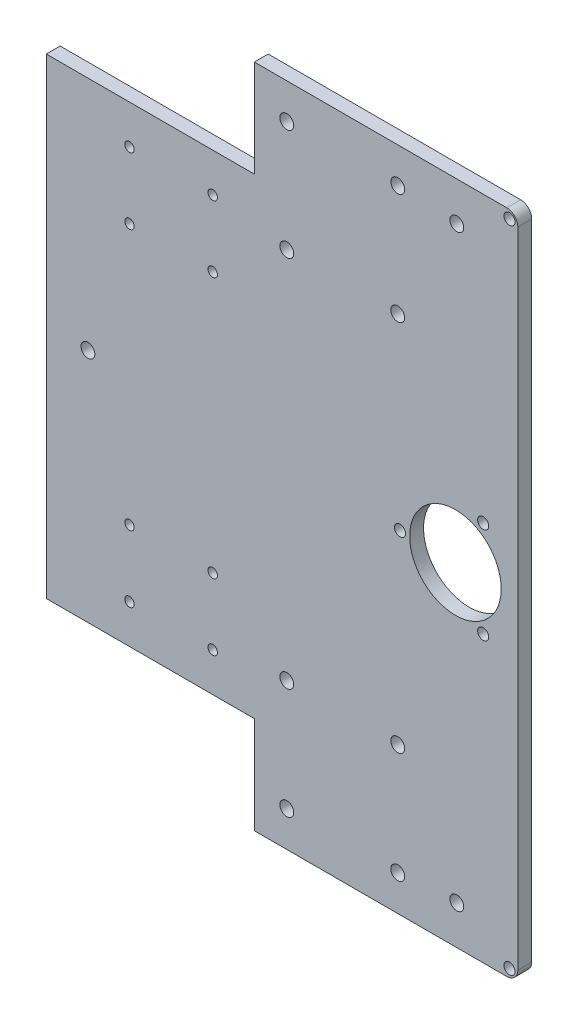
ISO-10303-21;
HEADER;
FILE_DESCRIPTION(('STEP AP214'),'2;1');
FILE_NAME('part.step','',(''),(''),'','','');
FILE_SCHEMA(('AUTOMOTIVE_DESIGN { 1 0 10303 214 1 1 1 1 }'));
ENDSEC;
DATA;
#1=APPLICATION_CONTEXT('core data for automotive mechanical design processes');
#2=APPLICATION_PROTOCOL_DEFINITION('international standard','automotive_design',2000,#1);
#3=PRODUCT_CONTEXT('',#1,'mechanical');
#4=PRODUCT('Part','Part','',(#3));
#5=PRODUCT_RELATED_PRODUCT_CATEGORY('part','',(#4));
#6=PRODUCT_DEFINITION_FORMATION('','',#4);
#7=PRODUCT_DEFINITION_CONTEXT('part definition',#1,'design');
#8=PRODUCT_DEFINITION('design','',#6,#7);
#9=PRODUCT_DEFINITION_SHAPE('','',#8);
#10=(LENGTH_UNIT() NAMED_UNIT(*) SI_UNIT(.MILLI.,.METRE.));
#11=(NAMED_UNIT(*) PLANE_ANGLE_UNIT() SI_UNIT($,.RADIAN.));
#12=(NAMED_UNIT(*) SI_UNIT($,.STERADIAN.) SOLID_ANGLE_UNIT());
#13=UNCERTAINTY_MEASURE_WITH_UNIT(LENGTH_MEASURE(1.E-05),#10,'distance_accuracy_value','');
#14=(GEOMETRIC_REPRESENTATION_CONTEXT(3) GLOBAL_UNCERTAINTY_ASSIGNED_CONTEXT((#13)) GLOBAL_UNIT_ASSIGNED_CONTEXT((#10,
#11,#12)) REPRESENTATION_CONTEXT('',''));
#15=CARTESIAN_POINT('',(0.,0.,0.));
#16=DIRECTION('',(0.,0.,1.));
#17=DIRECTION('',(1.,0.,0.));
#18=AXIS2_PLACEMENT_3D('',#15,#16,#17);
#19=CARTESIAN_POINT('',(85.,120.,5.));
#20=DIRECTION('',(-1.,0.,0.));
#21=DIRECTION('',(0.,0.,1.));
#22=AXIS2_PLACEMENT_3D('',#19,#20,#21);
#23=PLANE('',#22);
#24=DIRECTION('',(0.,1.,0.));
#25=VECTOR('',#24,1.);
#26=CARTESIAN_POINT('',(85.,120.,0.));
#27=LINE('',#26,#25);
#28=CARTESIAN_POINT('',(85.,-116.,0.));
#29=VERTEX_POINT('',#28);
#30=CARTESIAN_POINT('',(85.,116.,0.));
#31=VERTEX_POINT('',#30);
#32=EDGE_CURVE('E120',#29,#31,#27,.T.);
#33=ORIENTED_EDGE('',*,*,#32,.T.);
#34=DIRECTION('',(0.,0.,-1.));
#35=VECTOR('',#34,1.);
#36=CARTESIAN_POINT('',(85.,116.,5.));
#37=LINE('',#36,#35);
#38=CARTESIAN_POINT('',(85.,116.,5.));
#39=VERTEX_POINT('',#38);
#40=EDGE_CURVE('E42',#31,#39,#37,.F.);
#41=ORIENTED_EDGE('',*,*,#40,.T.);
#42=DIRECTION('',(0.,1.,0.));
#43=VECTOR('',#42,1.);
#44=CARTESIAN_POINT('',(85.,120.,5.));
#45=LINE('',#44,#43);
#46=CARTESIAN_POINT('',(85.,-116.,5.));
#47=VERTEX_POINT('',#46);
#48=EDGE_CURVE('E239',#47,#39,#45,.T.);
#49=ORIENTED_EDGE('',*,*,#48,.F.);
#50=DIRECTION('',(0.,0.,-1.));
#51=VECTOR('',#50,1.);
#52=CARTESIAN_POINT('',(85.,-116.,5.));
#53=LINE('',#52,#51);
#54=EDGE_CURVE('E250',#47,#29,#53,.T.);
#55=ORIENTED_EDGE('',*,*,#54,.T.);
#56=EDGE_LOOP('',(#33,#41,#49,#55));
#57=FACE_BOUND('',#56,.T.);
#58=ADVANCED_FACE('F34',(#57),#23,.F.);
#59=CARTESIAN_POINT('',(-85.,120.,5.));
#60=DIRECTION('',(0.,-1.,0.));
#61=DIRECTION('',(0.,0.,-1.));
#62=AXIS2_PLACEMENT_3D('',#59,#60,#61);
#63=PLANE('',#62);
#64=DIRECTION('',(-1.,0.,0.));
#65=VECTOR('',#64,1.);
#66=CARTESIAN_POINT('',(-85.,120.,5.));
#67=LINE('',#66,#65);
#68=CARTESIAN_POINT('',(81.,120.,5.));
#69=VERTEX_POINT('',#68);
#70=CARTESIAN_POINT('',(-10.,120.,5.));
#71=VERTEX_POINT('',#70);
#72=EDGE_CURVE('E241',#69,#71,#67,.T.);
#73=ORIENTED_EDGE('',*,*,#72,.F.);
#74=DIRECTION('',(0.,0.,-1.));
#75=VECTOR('',#74,1.);
#76=CARTESIAN_POINT('',(81.,120.,5.));
#77=LINE('',#76,#75);
#78=CARTESIAN_POINT('',(81.,120.,0.));
#79=VERTEX_POINT('',#78);
#80=EDGE_CURVE('E117',#69,#79,#77,.T.);
#81=ORIENTED_EDGE('',*,*,#80,.T.);
#82=DIRECTION('',(-1.,0.,0.));
#83=VECTOR('',#82,1.);
#84=CARTESIAN_POINT('',(-85.,120.,0.));
#85=LINE('',#84,#83);
#86=CARTESIAN_POINT('',(-10.,120.,0.));
#87=VERTEX_POINT('',#86);
#88=EDGE_CURVE('E111',#79,#87,#85,.T.);
#89=ORIENTED_EDGE('',*,*,#88,.T.);
#90=DIRECTION('',(0.,0.,1.));
#91=VECTOR('',#90,1.);
#92=CARTESIAN_POINT('',(-10.,120.,0.));
#93=LINE('',#92,#91);
#94=EDGE_CURVE('E115',#87,#71,#93,.T.);
#95=ORIENTED_EDGE('',*,*,#94,.T.);
#96=EDGE_LOOP('',(#73,#81,#89,#95));
#97=FACE_BOUND('',#96,.T.);
#98=ADVANCED_FACE('F114',(#97),#63,.F.);
#99=CARTESIAN_POINT('',(-85.,120.,5.));
#100=DIRECTION('',(1.,0.,0.));
#101=DIRECTION('',(0.,1.,0.));
#102=AXIS2_PLACEMENT_3D('',#99,#100,#101);
#103=PLANE('',#102);
#104=DIRECTION('',(0.,-1.,0.));
#105=VECTOR('',#104,1.);
#106=CARTESIAN_POINT('',(-85.,120.,5.));
#107=LINE('',#106,#105);
#108=CARTESIAN_POINT('',(-85.,85.,5.));
#109=VERTEX_POINT('',#108);
#110=CARTESIAN_POINT('',(-85.,-85.,5.));
#111=VERTEX_POINT('',#110);
#112=EDGE_CURVE('E244',#109,#111,#107,.T.);
#113=ORIENTED_EDGE('',*,*,#112,.F.);
#114=DIRECTION('',(0.,0.,1.));
#115=VECTOR('',#114,1.);
#116=CARTESIAN_POINT('',(-85.,85.,0.));
#117=LINE('',#116,#115);
#118=CARTESIAN_POINT('',(-85.,85.,0.));
#119=VERTEX_POINT('',#118);
#120=EDGE_CURVE('E129',#119,#109,#117,.T.);
#121=ORIENTED_EDGE('',*,*,#120,.F.);
#122=DIRECTION('',(0.,-1.,0.));
#123=VECTOR('',#122,1.);
#124=CARTESIAN_POINT('',(-85.,120.,0.));
#125=LINE('',#124,#123);
#126=CARTESIAN_POINT('',(-85.,-85.,0.));
#127=VERTEX_POINT('',#126);
#128=EDGE_CURVE('E119',#119,#127,#125,.T.);
#129=ORIENTED_EDGE('',*,*,#128,.T.);
#130=DIRECTION('',(0.,0.,1.));
#131=VECTOR('',#130,1.);
#132=CARTESIAN_POINT('',(-85.,-85.,0.));
#133=LINE('',#132,#131);
#134=EDGE_CURVE('E164',#127,#111,#133,.T.);
#135=ORIENTED_EDGE('',*,*,#134,.T.);
#136=EDGE_LOOP('',(#113,#121,#129,#135));
#137=FACE_BOUND('',#136,.T.);
#138=ADVANCED_FACE('F289',(#137),#103,.F.);
#139=CARTESIAN_POINT('',(-85.,-120.,5.));
#140=DIRECTION('',(0.,1.,0.));
#141=DIRECTION('',(0.,0.,1.));
#142=AXIS2_PLACEMENT_3D('',#139,#140,#141);
#143=PLANE('',#142);
#144=DIRECTION('',(1.,0.,0.));
#145=VECTOR('',#144,1.);
#146=CARTESIAN_POINT('',(-85.,-120.,0.));
#147=LINE('',#146,#145);
#148=CARTESIAN_POINT('',(-10.,-120.,0.));
#149=VERTEX_POINT('',#148);
#150=CARTESIAN_POINT('',(81.,-120.,0.));
#151=VERTEX_POINT('',#150);
#152=EDGE_CURVE('E242',#149,#151,#147,.T.);
#153=ORIENTED_EDGE('',*,*,#152,.T.);
#154=DIRECTION('',(0.,0.,-1.));
#155=VECTOR('',#154,1.);
#156=CARTESIAN_POINT('',(81.,-120.,5.));
#157=LINE('',#156,#155);
#158=CARTESIAN_POINT('',(81.,-120.,5.));
#159=VERTEX_POINT('',#158);
#160=EDGE_CURVE('E260',#151,#159,#157,.F.);
#161=ORIENTED_EDGE('',*,*,#160,.T.);
#162=DIRECTION('',(1.,0.,0.));
#163=VECTOR('',#162,1.);
#164=CARTESIAN_POINT('',(-85.,-120.,5.));
#165=LINE('',#164,#163);
#166=CARTESIAN_POINT('',(-10.,-120.,5.));
#167=VERTEX_POINT('',#166);
#168=EDGE_CURVE('E247',#167,#159,#165,.T.);
#169=ORIENTED_EDGE('',*,*,#168,.F.);
#170=DIRECTION('',(0.,0.,1.));
#171=VECTOR('',#170,1.);
#172=CARTESIAN_POINT('',(-10.,-120.,0.));
#173=LINE('',#172,#171);
#174=EDGE_CURVE('E144',#149,#167,#173,.T.);
#175=ORIENTED_EDGE('',*,*,#174,.F.);
#176=EDGE_LOOP('',(#153,#161,#169,#175));
#177=FACE_BOUND('',#176,.T.);
#178=ADVANCED_FACE('F279',(#177),#143,.F.);
#179=CARTESIAN_POINT('',(0.,0.,5.));
#180=DIRECTION('',(0.,0.,1.));
#181=DIRECTION('',(1.,0.,0.));
#182=AXIS2_PLACEMENT_3D('',#179,#180,#181);
#183=PLANE('',#182);
#184=CARTESIAN_POINT('',(62.9999999999836,105.99999999999,5.));
#185=DIRECTION('',(0.,0.,-1.));
#186=DIRECTION('',(-1.,0.,0.));
#187=AXIS2_PLACEMENT_3D('',#184,#185,#186);
#188=CIRCLE('',#187,2.49999999998859);
#189=CARTESIAN_POINT('',(60.499999999995,105.99999999999,5.));
#190=VERTEX_POINT('',#189);
#191=EDGE_CURVE('E597',#190,#190,#188,.T.);
#192=ORIENTED_EDGE('',*,*,#191,.T.);
#193=EDGE_LOOP('',(#192));
#194=FACE_BOUND('',#193,.T.);
#195=CARTESIAN_POINT('',(62.9999999999836,-105.99999999999,5.));
#196=DIRECTION('',(0.,0.,-1.));
#197=DIRECTION('',(-1.,0.,0.));
#198=AXIS2_PLACEMENT_3D('',#195,#196,#197);
#199=CIRCLE('',#198,2.5);
#200=CARTESIAN_POINT('',(60.4999999999836,-105.99999999999,5.));
#201=VERTEX_POINT('',#200);
#202=EDGE_CURVE('E601',#201,#201,#199,.T.);
#203=ORIENTED_EDGE('',*,*,#202,.T.);
#204=EDGE_LOOP('',(#203));
#205=FACE_BOUND('',#204,.T.);
#206=CARTESIAN_POINT('',(-69.9999999999836,-3.0158167629857E-12,5.));
#207=DIRECTION('',(0.,0.,-1.));
#208=DIRECTION('',(-1.,0.,0.));
#209=AXIS2_PLACEMENT_3D('',#206,#207,#208);
#210=CIRCLE('',#209,2.50000000000001);
#211=CARTESIAN_POINT('',(-72.4999999999836,-3.0158167629857E-12,5.));
#212=VERTEX_POINT('',#211);
#213=EDGE_CURVE('E611',#212,#212,#210,.T.);
#214=ORIENTED_EDGE('',*,*,#213,.T.);
#215=EDGE_LOOP('',(#214));
#216=FACE_BOUND('',#215,.T.);
#217=CARTESIAN_POINT('',(41.7,-107.25,5.));
#218=DIRECTION('',(0.,0.,1.));
#219=DIRECTION('',(1.,0.,0.));
#220=AXIS2_PLACEMENT_3D('',#217,#218,#219);
#221=CIRCLE('',#220,2.5);
#222=CARTESIAN_POINT('',(44.2,-107.25,5.));
#223=VERTEX_POINT('',#222);
#224=EDGE_CURVE('E620',#223,#223,#221,.T.);
#225=ORIENTED_EDGE('',*,*,#224,.F.);
#226=EDGE_LOOP('',(#225));
#227=FACE_BOUND('',#226,.T.);
#228=CARTESIAN_POINT('',(1.69999999999997,107.25,5.));
#229=DIRECTION('',(0.,0.,1.));
#230=DIRECTION('',(1.,0.,0.));
#231=AXIS2_PLACEMENT_3D('',#228,#229,#230);
#232=CIRCLE('',#231,2.5);
#233=CARTESIAN_POINT('',(4.19999999999997,107.25,5.));
#234=VERTEX_POINT('',#233);
#235=EDGE_CURVE('E639',#234,#234,#232,.T.);
#236=ORIENTED_EDGE('',*,*,#235,.F.);
#237=EDGE_LOOP('',(#236));
#238=FACE_BOUND('',#237,.T.);
#239=CARTESIAN_POINT('',(1.69999999999997,67.2499999999999,5.));
#240=DIRECTION('',(0.,0.,1.));
#241=DIRECTION('',(1.,0.,0.));
#242=AXIS2_PLACEMENT_3D('',#239,#240,#241);
#243=CIRCLE('',#242,2.5);
#244=CARTESIAN_POINT('',(4.19999999999997,67.2499999999999,5.));
#245=VERTEX_POINT('',#244);
#246=EDGE_CURVE('E638',#245,#245,#243,.T.);
#247=ORIENTED_EDGE('',*,*,#246,.F.);
#248=EDGE_LOOP('',(#247));
#249=FACE_BOUND('',#248,.T.);
#250=CARTESIAN_POINT('',(41.7,67.2499999999999,5.));
#251=DIRECTION('',(0.,0.,1.));
#252=DIRECTION('',(1.,0.,0.));
#253=AXIS2_PLACEMENT_3D('',#250,#251,#252);
#254=CIRCLE('',#253,2.5);
#255=CARTESIAN_POINT('',(44.2,67.2499999999999,5.));
#256=VERTEX_POINT('',#255);
#257=EDGE_CURVE('E651',#256,#256,#254,.T.);
#258=ORIENTED_EDGE('',*,*,#257,.F.);
#259=EDGE_LOOP('',(#258));
#260=FACE_BOUND('',#259,.T.);
#261=CARTESIAN_POINT('',(1.69999999999997,-107.25,5.));
#262=DIRECTION('',(0.,0.,1.));
#263=DIRECTION('',(1.,0.,0.));
#264=AXIS2_PLACEMENT_3D('',#261,#262,#263);
#265=CIRCLE('',#264,2.5);
#266=CARTESIAN_POINT('',(4.19999999999997,-107.25,5.));
#267=VERTEX_POINT('',#266);
#268=EDGE_CURVE('E621',#267,#267,#265,.T.);
#269=ORIENTED_EDGE('',*,*,#268,.F.);
#270=EDGE_LOOP('',(#269));
#271=FACE_BOUND('',#270,.T.);
#272=CARTESIAN_POINT('',(1.69999999999997,-67.2499999999999,5.));
#273=DIRECTION('',(0.,0.,1.));
#274=DIRECTION('',(1.,0.,0.));
#275=AXIS2_PLACEMENT_3D('',#272,#273,#274);
#276=CIRCLE('',#275,2.5);
#277=CARTESIAN_POINT('',(4.19999999999997,-67.2499999999999,5.));
#278=VERTEX_POINT('',#277);
#279=EDGE_CURVE('E627',#278,#278,#276,.T.);
#280=ORIENTED_EDGE('',*,*,#279,.F.);
#281=EDGE_LOOP('',(#280));
#282=FACE_BOUND('',#281,.T.);
#283=CARTESIAN_POINT('',(41.7,-67.2499999999999,5.));
#284=DIRECTION('',(0.,0.,1.));
#285=DIRECTION('',(1.,0.,0.));
#286=AXIS2_PLACEMENT_3D('',#283,#284,#285);
#287=CIRCLE('',#286,2.5);
#288=CARTESIAN_POINT('',(44.2,-67.2499999999999,5.));
#289=VERTEX_POINT('',#288);
#290=EDGE_CURVE('E603',#289,#289,#287,.T.);
#291=ORIENTED_EDGE('',*,*,#290,.F.);
#292=EDGE_LOOP('',(#291));
#293=FACE_BOUND('',#292,.T.);
#294=CARTESIAN_POINT('',(41.7,107.25,5.));
#295=DIRECTION('',(0.,0.,1.));
#296=DIRECTION('',(1.,0.,0.));
#297=AXIS2_PLACEMENT_3D('',#294,#295,#296);
#298=CIRCLE('',#297,2.5);
#299=CARTESIAN_POINT('',(44.2,107.25,5.));
#300=VERTEX_POINT('',#299);
#301=EDGE_CURVE('E650',#300,#300,#298,.T.);
#302=ORIENTED_EDGE('',*,*,#301,.F.);
#303=EDGE_LOOP('',(#302));
#304=FACE_BOUND('',#303,.T.);
#305=CARTESIAN_POINT('',(82.,117.,5.));
#306=DIRECTION('',(0.,0.,-1.));
#307=DIRECTION('',(1.,0.,0.));
#308=AXIS2_PLACEMENT_3D('',#305,#306,#307);
#309=CIRCLE('',#308,2.);
#310=CARTESIAN_POINT('',(84.,117.,5.));
#311=VERTEX_POINT('',#310);
#312=EDGE_CURVE('E662',#311,#311,#309,.T.);
#313=ORIENTED_EDGE('',*,*,#312,.T.);
#314=EDGE_LOOP('',(#313));
#315=FACE_BOUND('',#314,.T.);
#316=CARTESIAN_POINT('',(82.,-117.,5.));
#317=DIRECTION('',(0.,0.,1.));
#318=DIRECTION('',(1.,0.,0.));
#319=AXIS2_PLACEMENT_3D('',#316,#317,#318);
#320=CIRCLE('',#319,2.);
#321=CARTESIAN_POINT('',(84.,-117.,5.));
#322=VERTEX_POINT('',#321);
#323=EDGE_CURVE('E141',#322,#322,#320,.T.);
#324=ORIENTED_EDGE('',*,*,#323,.F.);
#325=EDGE_LOOP('',(#324));
#326=FACE_BOUND('',#325,.T.);
#327=ORIENTED_EDGE('',*,*,#48,.T.);
#328=CARTESIAN_POINT('',(81.,116.,5.));
#329=DIRECTION('',(0.,0.,1.));
#330=DIRECTION('',(1.,0.,0.));
#331=AXIS2_PLACEMENT_3D('',#328,#329,#330);
#332=CIRCLE('',#331,4.);
#333=EDGE_CURVE('E11',#39,#69,#332,.T.);
#334=ORIENTED_EDGE('',*,*,#333,.T.);
#335=ORIENTED_EDGE('',*,*,#72,.T.);
#336=DIRECTION('',(0.,1.,0.));
#337=VECTOR('',#336,1.);
#338=CARTESIAN_POINT('',(-10.,120.,5.));
#339=LINE('',#338,#337);
#340=CARTESIAN_POINT('',(-10.,85.,5.));
#341=VERTEX_POINT('',#340);
#342=EDGE_CURVE('E128',#341,#71,#339,.T.);
#343=ORIENTED_EDGE('',*,*,#342,.F.);
#344=DIRECTION('',(1.,0.,0.));
#345=VECTOR('',#344,1.);
#346=CARTESIAN_POINT('',(-10.,85.,5.));
#347=LINE('',#346,#345);
#348=EDGE_CURVE('E135',#109,#341,#347,.T.);
#349=ORIENTED_EDGE('',*,*,#348,.F.);
#350=ORIENTED_EDGE('',*,*,#112,.T.);
#351=DIRECTION('',(-1.,0.,0.));
#352=VECTOR('',#351,1.);
#353=CARTESIAN_POINT('',(-10.,-85.,5.));
#354=LINE('',#353,#352);
#355=CARTESIAN_POINT('',(-10.,-85.,5.));
#356=VERTEX_POINT('',#355);
#357=EDGE_CURVE('E154',#356,#111,#354,.T.);
#358=ORIENTED_EDGE('',*,*,#357,.F.);
#359=DIRECTION('',(0.,1.,0.));
#360=VECTOR('',#359,1.);
#361=CARTESIAN_POINT('',(-10.,-120.,5.));
#362=LINE('',#361,#360);
#363=EDGE_CURVE('E158',#167,#356,#362,.T.);
#364=ORIENTED_EDGE('',*,*,#363,.F.);
#365=ORIENTED_EDGE('',*,*,#168,.T.);
#366=CARTESIAN_POINT('',(81.,-116.,5.));
#367=DIRECTION('',(0.,0.,1.));
#368=DIRECTION('',(1.,0.,0.));
#369=AXIS2_PLACEMENT_3D('',#366,#367,#368);
#370=CIRCLE('',#369,4.);
#371=EDGE_CURVE('E262',#159,#47,#370,.T.);
#372=ORIENTED_EDGE('',*,*,#371,.T.);
#373=EDGE_LOOP('',(#327,#334,#335,#343,#349,#350,#358,#364,#365,#372));
#374=FACE_BOUND('',#373,.T.);
#375=CARTESIAN_POINT('',(-55.,-70.9999999999998,5.));
#376=DIRECTION('',(0.,0.,1.));
#377=DIRECTION('',(-1.,0.,0.));
#378=AXIS2_PLACEMENT_3D('',#375,#376,#377);
#379=CIRCLE('',#378,1.69999999999998);
#380=CARTESIAN_POINT('',(-56.7,-70.9999999999998,5.));
#381=VERTEX_POINT('',#380);
#382=EDGE_CURVE('E177',#381,#381,#379,.T.);
#383=ORIENTED_EDGE('',*,*,#382,.F.);
#384=EDGE_LOOP('',(#383));
#385=FACE_BOUND('',#384,.T.);
#386=CARTESIAN_POINT('',(-55.,70.9999999999998,5.));
#387=DIRECTION('',(0.,0.,1.));
#388=DIRECTION('',(1.,0.,0.));
#389=AXIS2_PLACEMENT_3D('',#386,#387,#388);
#390=CIRCLE('',#389,1.69999999999998);
#391=CARTESIAN_POINT('',(-53.3,70.9999999999998,5.));
#392=VERTEX_POINT('',#391);
#393=EDGE_CURVE('E190',#392,#392,#390,.T.);
#394=ORIENTED_EDGE('',*,*,#393,.F.);
#395=EDGE_LOOP('',(#394));
#396=FACE_BOUND('',#395,.T.);
#397=CARTESIAN_POINT('',(-55.,46.9999999999998,5.));
#398=DIRECTION('',(0.,0.,1.));
#399=DIRECTION('',(1.,0.,0.));
#400=AXIS2_PLACEMENT_3D('',#397,#398,#399);
#401=CIRCLE('',#400,1.69999999999998);
#402=CARTESIAN_POINT('',(-53.3,46.9999999999998,5.));
#403=VERTEX_POINT('',#402);
#404=EDGE_CURVE('E189',#403,#403,#401,.T.);
#405=ORIENTED_EDGE('',*,*,#404,.F.);
#406=EDGE_LOOP('',(#405));
#407=FACE_BOUND('',#406,.T.);
#408=CARTESIAN_POINT('',(-25.,70.9999999999998,5.));
#409=DIRECTION('',(0.,0.,1.));
#410=DIRECTION('',(1.,0.,0.));
#411=AXIS2_PLACEMENT_3D('',#408,#409,#410);
#412=CIRCLE('',#411,1.7);
#413=CARTESIAN_POINT('',(-23.3,70.9999999999998,5.));
#414=VERTEX_POINT('',#413);
#415=EDGE_CURVE('E202',#414,#414,#412,.T.);
#416=ORIENTED_EDGE('',*,*,#415,.F.);
#417=EDGE_LOOP('',(#416));
#418=FACE_BOUND('',#417,.T.);
#419=CARTESIAN_POINT('',(-25.,-46.9999999999998,5.));
#420=DIRECTION('',(0.,0.,1.));
#421=DIRECTION('',(-1.,0.,0.));
#422=AXIS2_PLACEMENT_3D('',#419,#420,#421);
#423=CIRCLE('',#422,1.70000000000001);
#424=CARTESIAN_POINT('',(-26.7,-46.9999999999998,5.));
#425=VERTEX_POINT('',#424);
#426=EDGE_CURVE('E148',#425,#425,#423,.T.);
#427=ORIENTED_EDGE('',*,*,#426,.F.);
#428=EDGE_LOOP('',(#427));
#429=FACE_BOUND('',#428,.T.);
#430=CARTESIAN_POINT('',(-55.,-46.9999999999998,5.));
#431=DIRECTION('',(0.,0.,1.));
#432=DIRECTION('',(-1.,0.,0.));
#433=AXIS2_PLACEMENT_3D('',#430,#431,#432);
#434=CIRCLE('',#433,1.69999999999998);
#435=CARTESIAN_POINT('',(-56.7,-46.9999999999998,5.));
#436=VERTEX_POINT('',#435);
#437=EDGE_CURVE('E171',#436,#436,#434,.T.);
#438=ORIENTED_EDGE('',*,*,#437,.F.);
#439=EDGE_LOOP('',(#438));
#440=FACE_BOUND('',#439,.T.);
#441=CARTESIAN_POINT('',(-25.,-70.9999999999998,5.));
#442=DIRECTION('',(0.,0.,1.));
#443=DIRECTION('',(-1.,0.,0.));
#444=AXIS2_PLACEMENT_3D('',#441,#442,#443);
#445=CIRCLE('',#444,1.7);
#446=CARTESIAN_POINT('',(-26.7,-70.9999999999998,5.));
#447=VERTEX_POINT('',#446);
#448=EDGE_CURVE('E178',#447,#447,#445,.T.);
#449=ORIENTED_EDGE('',*,*,#448,.F.);
#450=EDGE_LOOP('',(#449));
#451=FACE_BOUND('',#450,.T.);
#452=CARTESIAN_POINT('',(-25.,46.9999999999998,5.));
#453=DIRECTION('',(0.,0.,1.));
#454=DIRECTION('',(1.,0.,0.));
#455=AXIS2_PLACEMENT_3D('',#452,#453,#454);
#456=CIRCLE('',#455,1.70000000000001);
#457=CARTESIAN_POINT('',(-23.3,46.9999999999998,5.));
#458=VERTEX_POINT('',#457);
#459=EDGE_CURVE('E201',#458,#458,#456,.T.);
#460=ORIENTED_EDGE('',*,*,#459,.F.);
#461=EDGE_LOOP('',(#460));
#462=FACE_BOUND('',#461,.T.);
#463=CARTESIAN_POINT('',(72.5000000000001,-17.3205080756889,5.));
#464=DIRECTION('',(0.,0.,1.));
#465=DIRECTION('',(1.,0.,0.));
#466=AXIS2_PLACEMENT_3D('',#463,#464,#465);
#467=CIRCLE('',#466,2.00000000000001);
#468=CARTESIAN_POINT('',(74.5000000000001,-17.3205080756889,5.));
#469=VERTEX_POINT('',#468);
#470=EDGE_CURVE('E220',#469,#469,#467,.T.);
#471=ORIENTED_EDGE('',*,*,#470,.F.);
#472=EDGE_LOOP('',(#471));
#473=FACE_BOUND('',#472,.T.);
#474=CARTESIAN_POINT('',(72.5000000000001,17.3205080756887,5.));
#475=DIRECTION('',(0.,0.,1.));
#476=DIRECTION('',(1.,0.,0.));
#477=AXIS2_PLACEMENT_3D('',#474,#475,#476);
#478=CIRCLE('',#477,2.);
#479=CARTESIAN_POINT('',(74.5000000000001,17.3205080756887,5.));
#480=VERTEX_POINT('',#479);
#481=EDGE_CURVE('E226',#480,#480,#478,.T.);
#482=ORIENTED_EDGE('',*,*,#481,.F.);
#483=EDGE_LOOP('',(#482));
#484=FACE_BOUND('',#483,.T.);
#485=CARTESIAN_POINT('',(42.5000000000001,0.,5.));
#486=DIRECTION('',(0.,0.,1.));
#487=DIRECTION('',(1.,0.,0.));
#488=AXIS2_PLACEMENT_3D('',#485,#486,#487);
#489=CIRCLE('',#488,2.);
#490=CARTESIAN_POINT('',(44.5000000000001,0.,5.));
#491=VERTEX_POINT('',#490);
#492=EDGE_CURVE('E213',#491,#491,#489,.T.);
#493=ORIENTED_EDGE('',*,*,#492,.F.);
#494=EDGE_LOOP('',(#493));
#495=FACE_BOUND('',#494,.T.);
#496=CARTESIAN_POINT('',(62.5000000000001,-1.2490009027033E-13,5.));
#497=DIRECTION('',(0.,0.,1.));
#498=DIRECTION('',(1.,0.,0.));
#499=AXIS2_PLACEMENT_3D('',#496,#497,#498);
#500=CIRCLE('',#499,16.5);
#501=CARTESIAN_POINT('',(79.0000000000002,-1.2490009027033E-13,5.));
#502=VERTEX_POINT('',#501);
#503=EDGE_CURVE('E219',#502,#502,#500,.T.);
#504=ORIENTED_EDGE('',*,*,#503,.F.);
#505=EDGE_LOOP('',(#504));
#506=FACE_BOUND('',#505,.T.);
#507=ADVANCED_FACE('F267',(#194,#205,#216,#227,#238,#249,#260,#271,#282,#293,#304,#315,#326,
#374,#385,#396,#407,#418,#429,#440,#451,#462,#473,#484,#495,#506),#183,.T.);
#508=CARTESIAN_POINT('',(0.,0.,0.));
#509=DIRECTION('',(0.,0.,1.));
#510=DIRECTION('',(1.,0.,0.));
#511=AXIS2_PLACEMENT_3D('',#508,#509,#510);
#512=PLANE('',#511);
#513=CARTESIAN_POINT('',(62.9999999999836,105.99999999999,0.));
#514=DIRECTION('',(0.,0.,-1.));
#515=DIRECTION('',(-1.,0.,0.));
#516=AXIS2_PLACEMENT_3D('',#513,#514,#515);
#517=CIRCLE('',#516,2.49999999998859);
#518=CARTESIAN_POINT('',(60.499999999995,105.99999999999,0.));
#519=VERTEX_POINT('',#518);
#520=EDGE_CURVE('E600',#519,#519,#517,.T.);
#521=ORIENTED_EDGE('',*,*,#520,.F.);
#522=EDGE_LOOP('',(#521));
#523=FACE_BOUND('',#522,.T.);
#524=CARTESIAN_POINT('',(62.9999999999836,-105.99999999999,0.));
#525=DIRECTION('',(0.,0.,-1.));
#526=DIRECTION('',(-1.,0.,0.));
#527=AXIS2_PLACEMENT_3D('',#524,#525,#526);
#528=CIRCLE('',#527,2.5);
#529=CARTESIAN_POINT('',(60.4999999999836,-105.99999999999,0.));
#530=VERTEX_POINT('',#529);
#531=EDGE_CURVE('E606',#530,#530,#528,.T.);
#532=ORIENTED_EDGE('',*,*,#531,.F.);
#533=EDGE_LOOP('',(#532));
#534=FACE_BOUND('',#533,.T.);
#535=CARTESIAN_POINT('',(-69.9999999999836,-3.0158167629857E-12,0.));
#536=DIRECTION('',(0.,0.,-1.));
#537=DIRECTION('',(-1.,0.,0.));
#538=AXIS2_PLACEMENT_3D('',#535,#536,#537);
#539=CIRCLE('',#538,2.50000000000001);
#540=CARTESIAN_POINT('',(-72.4999999999836,-3.0158167629857E-12,0.));
#541=VERTEX_POINT('',#540);
#542=EDGE_CURVE('E614',#541,#541,#539,.T.);
#543=ORIENTED_EDGE('',*,*,#542,.F.);
#544=EDGE_LOOP('',(#543));
#545=FACE_BOUND('',#544,.T.);
#546=CARTESIAN_POINT('',(41.7,-107.25,0.));
#547=DIRECTION('',(0.,0.,1.));
#548=DIRECTION('',(1.,0.,0.));
#549=AXIS2_PLACEMENT_3D('',#546,#547,#548);
#550=CIRCLE('',#549,2.5);
#551=CARTESIAN_POINT('',(44.2,-107.25,0.));
#552=VERTEX_POINT('',#551);
#553=EDGE_CURVE('E642',#552,#552,#550,.T.);
#554=ORIENTED_EDGE('',*,*,#553,.T.);
#555=EDGE_LOOP('',(#554));
#556=FACE_BOUND('',#555,.T.);
#557=CARTESIAN_POINT('',(1.69999999999997,107.25,0.));
#558=DIRECTION('',(0.,0.,1.));
#559=DIRECTION('',(1.,0.,0.));
#560=AXIS2_PLACEMENT_3D('',#557,#558,#559);
#561=CIRCLE('',#560,2.5);
#562=CARTESIAN_POINT('',(4.19999999999997,107.25,0.));
#563=VERTEX_POINT('',#562);
#564=EDGE_CURVE('E635',#563,#563,#561,.T.);
#565=ORIENTED_EDGE('',*,*,#564,.T.);
#566=EDGE_LOOP('',(#565));
#567=FACE_BOUND('',#566,.T.);
#568=CARTESIAN_POINT('',(1.69999999999997,67.2499999999999,0.));
#569=DIRECTION('',(0.,0.,1.));
#570=DIRECTION('',(1.,0.,0.));
#571=AXIS2_PLACEMENT_3D('',#568,#569,#570);
#572=CIRCLE('',#571,2.5);
#573=CARTESIAN_POINT('',(4.19999999999997,67.2499999999999,0.));
#574=VERTEX_POINT('',#573);
#575=EDGE_CURVE('E654',#574,#574,#572,.T.);
#576=ORIENTED_EDGE('',*,*,#575,.T.);
#577=EDGE_LOOP('',(#576));
#578=FACE_BOUND('',#577,.T.);
#579=CARTESIAN_POINT('',(41.7,67.2499999999999,0.));
#580=DIRECTION('',(0.,0.,1.));
#581=DIRECTION('',(1.,0.,0.));
#582=AXIS2_PLACEMENT_3D('',#579,#580,#581);
#583=CIRCLE('',#582,2.5);
#584=CARTESIAN_POINT('',(44.2,67.2499999999999,0.));
#585=VERTEX_POINT('',#584);
#586=EDGE_CURVE('E647',#585,#585,#583,.T.);
#587=ORIENTED_EDGE('',*,*,#586,.T.);
#588=EDGE_LOOP('',(#587));
#589=FACE_BOUND('',#588,.T.);
#590=CARTESIAN_POINT('',(1.69999999999997,-107.25,0.));
#591=DIRECTION('',(0.,0.,1.));
#592=DIRECTION('',(1.,0.,0.));
#593=AXIS2_PLACEMENT_3D('',#590,#591,#592);
#594=CIRCLE('',#593,2.5);
#595=CARTESIAN_POINT('',(4.19999999999997,-107.25,0.));
#596=VERTEX_POINT('',#595);
#597=EDGE_CURVE('E617',#596,#596,#594,.T.);
#598=ORIENTED_EDGE('',*,*,#597,.T.);
#599=EDGE_LOOP('',(#598));
#600=FACE_BOUND('',#599,.T.);
#601=CARTESIAN_POINT('',(1.69999999999997,-67.2499999999999,0.));
#602=DIRECTION('',(0.,0.,1.));
#603=DIRECTION('',(1.,0.,0.));
#604=AXIS2_PLACEMENT_3D('',#601,#602,#603);
#605=CIRCLE('',#604,2.5);
#606=CARTESIAN_POINT('',(4.19999999999997,-67.2499999999999,0.));
#607=VERTEX_POINT('',#606);
#608=EDGE_CURVE('E624',#607,#607,#605,.T.);
#609=ORIENTED_EDGE('',*,*,#608,.T.);
#610=EDGE_LOOP('',(#609));
#611=FACE_BOUND('',#610,.T.);
#612=CARTESIAN_POINT('',(41.7,-67.2499999999999,0.));
#613=DIRECTION('',(0.,0.,1.));
#614=DIRECTION('',(1.,0.,0.));
#615=AXIS2_PLACEMENT_3D('',#612,#613,#614);
#616=CIRCLE('',#615,2.5);
#617=CARTESIAN_POINT('',(44.2,-67.2499999999999,0.));
#618=VERTEX_POINT('',#617);
#619=EDGE_CURVE('E630',#618,#618,#616,.T.);
#620=ORIENTED_EDGE('',*,*,#619,.T.);
#621=EDGE_LOOP('',(#620));
#622=FACE_BOUND('',#621,.T.);
#623=CARTESIAN_POINT('',(41.7,107.25,0.));
#624=DIRECTION('',(0.,0.,1.));
#625=DIRECTION('',(1.,0.,0.));
#626=AXIS2_PLACEMENT_3D('',#623,#624,#625);
#627=CIRCLE('',#626,2.5);
#628=CARTESIAN_POINT('',(44.2,107.25,0.));
#629=VERTEX_POINT('',#628);
#630=EDGE_CURVE('E659',#629,#629,#627,.T.);
#631=ORIENTED_EDGE('',*,*,#630,.T.);
#632=EDGE_LOOP('',(#631));
#633=FACE_BOUND('',#632,.T.);
#634=CARTESIAN_POINT('',(82.,117.,0.));
#635=DIRECTION('',(0.,0.,-1.));
#636=DIRECTION('',(1.,0.,0.));
#637=AXIS2_PLACEMENT_3D('',#634,#635,#636);
#638=CIRCLE('',#637,2.);
#639=CARTESIAN_POINT('',(84.,117.,0.));
#640=VERTEX_POINT('',#639);
#641=EDGE_CURVE('E665',#640,#640,#638,.T.);
#642=ORIENTED_EDGE('',*,*,#641,.F.);
#643=EDGE_LOOP('',(#642));
#644=FACE_BOUND('',#643,.T.);
#645=CARTESIAN_POINT('',(82.,-117.,0.));
#646=DIRECTION('',(0.,0.,1.));
#647=DIRECTION('',(1.,0.,0.));
#648=AXIS2_PLACEMENT_3D('',#645,#646,#647);
#649=CIRCLE('',#648,2.);
#650=CARTESIAN_POINT('',(84.,-117.,0.));
#651=VERTEX_POINT('',#650);
#652=EDGE_CURVE('E161',#651,#651,#649,.T.);
#653=ORIENTED_EDGE('',*,*,#652,.T.);
#654=EDGE_LOOP('',(#653));
#655=FACE_BOUND('',#654,.T.);
#656=CARTESIAN_POINT('',(-55.,-70.9999999999998,0.));
#657=DIRECTION('',(0.,0.,1.));
#658=DIRECTION('',(-1.,0.,0.));
#659=AXIS2_PLACEMENT_3D('',#656,#657,#658);
#660=CIRCLE('',#659,1.69999999999998);
#661=CARTESIAN_POINT('',(-56.7,-70.9999999999998,0.));
#662=VERTEX_POINT('',#661);
#663=EDGE_CURVE('E193',#662,#662,#660,.T.);
#664=ORIENTED_EDGE('',*,*,#663,.T.);
#665=EDGE_LOOP('',(#664));
#666=FACE_BOUND('',#665,.T.);
#667=CARTESIAN_POINT('',(-55.,70.9999999999998,0.));
#668=DIRECTION('',(0.,0.,1.));
#669=DIRECTION('',(1.,0.,0.));
#670=AXIS2_PLACEMENT_3D('',#667,#668,#669);
#671=CIRCLE('',#670,1.69999999999998);
#672=CARTESIAN_POINT('',(-53.3,70.9999999999998,0.));
#673=VERTEX_POINT('',#672);
#674=EDGE_CURVE('E186',#673,#673,#671,.T.);
#675=ORIENTED_EDGE('',*,*,#674,.T.);
#676=EDGE_LOOP('',(#675));
#677=FACE_BOUND('',#676,.T.);
#678=CARTESIAN_POINT('',(-55.,46.9999999999998,0.));
#679=DIRECTION('',(0.,0.,1.));
#680=DIRECTION('',(1.,0.,0.));
#681=AXIS2_PLACEMENT_3D('',#678,#679,#680);
#682=CIRCLE('',#681,1.69999999999998);
#683=CARTESIAN_POINT('',(-53.3,46.9999999999998,0.));
#684=VERTEX_POINT('',#683);
#685=EDGE_CURVE('E205',#684,#684,#682,.T.);
#686=ORIENTED_EDGE('',*,*,#685,.T.);
#687=EDGE_LOOP('',(#686));
#688=FACE_BOUND('',#687,.T.);
#689=CARTESIAN_POINT('',(-25.,70.9999999999998,0.));
#690=DIRECTION('',(0.,0.,1.));
#691=DIRECTION('',(1.,0.,0.));
#692=AXIS2_PLACEMENT_3D('',#689,#690,#691);
#693=CIRCLE('',#692,1.7);
#694=CARTESIAN_POINT('',(-23.3,70.9999999999998,0.));
#695=VERTEX_POINT('',#694);
#696=EDGE_CURVE('E198',#695,#695,#693,.T.);
#697=ORIENTED_EDGE('',*,*,#696,.T.);
#698=EDGE_LOOP('',(#697));
#699=FACE_BOUND('',#698,.T.);
#700=CARTESIAN_POINT('',(-25.,-46.9999999999998,0.));
#701=DIRECTION('',(0.,0.,1.));
#702=DIRECTION('',(-1.,0.,0.));
#703=AXIS2_PLACEMENT_3D('',#700,#701,#702);
#704=CIRCLE('',#703,1.70000000000001);
#705=CARTESIAN_POINT('',(-26.7,-46.9999999999998,0.));
#706=VERTEX_POINT('',#705);
#707=EDGE_CURVE('E168',#706,#706,#704,.T.);
#708=ORIENTED_EDGE('',*,*,#707,.T.);
#709=EDGE_LOOP('',(#708));
#710=FACE_BOUND('',#709,.T.);
#711=CARTESIAN_POINT('',(-55.,-46.9999999999998,0.));
#712=DIRECTION('',(0.,0.,1.));
#713=DIRECTION('',(-1.,0.,0.));
#714=AXIS2_PLACEMENT_3D('',#711,#712,#713);
#715=CIRCLE('',#714,1.69999999999998);
#716=CARTESIAN_POINT('',(-56.7,-46.9999999999998,0.));
#717=VERTEX_POINT('',#716);
#718=EDGE_CURVE('E181',#717,#717,#715,.T.);
#719=ORIENTED_EDGE('',*,*,#718,.T.);
#720=EDGE_LOOP('',(#719));
#721=FACE_BOUND('',#720,.T.);
#722=CARTESIAN_POINT('',(-25.,-70.9999999999998,0.));
#723=DIRECTION('',(0.,0.,1.));
#724=DIRECTION('',(-1.,0.,0.));
#725=AXIS2_PLACEMENT_3D('',#722,#723,#724);
#726=CIRCLE('',#725,1.7);
#727=CARTESIAN_POINT('',(-26.7,-70.9999999999998,0.));
#728=VERTEX_POINT('',#727);
#729=EDGE_CURVE('E174',#728,#728,#726,.T.);
#730=ORIENTED_EDGE('',*,*,#729,.T.);
#731=EDGE_LOOP('',(#730));
#732=FACE_BOUND('',#731,.T.);
#733=CARTESIAN_POINT('',(-25.,46.9999999999998,0.));
#734=DIRECTION('',(0.,0.,1.));
#735=DIRECTION('',(1.,0.,0.));
#736=AXIS2_PLACEMENT_3D('',#733,#734,#735);
#737=CIRCLE('',#736,1.70000000000001);
#738=CARTESIAN_POINT('',(-23.3,46.9999999999998,0.));
#739=VERTEX_POINT('',#738);
#740=EDGE_CURVE('E210',#739,#739,#737,.T.);
#741=ORIENTED_EDGE('',*,*,#740,.T.);
#742=EDGE_LOOP('',(#741));
#743=FACE_BOUND('',#742,.T.);
#744=CARTESIAN_POINT('',(72.5000000000001,-17.3205080756889,0.));
#745=DIRECTION('',(0.,0.,1.));
#746=DIRECTION('',(1.,0.,0.));
#747=AXIS2_PLACEMENT_3D('',#744,#745,#746);
#748=CIRCLE('',#747,2.00000000000001);
#749=CARTESIAN_POINT('',(74.5000000000001,-17.3205080756889,0.));
#750=VERTEX_POINT('',#749);
#751=EDGE_CURVE('E216',#750,#750,#748,.T.);
#752=ORIENTED_EDGE('',*,*,#751,.T.);
#753=EDGE_LOOP('',(#752));
#754=FACE_BOUND('',#753,.T.);
#755=CARTESIAN_POINT('',(72.5000000000001,17.3205080756887,0.));
#756=DIRECTION('',(0.,0.,1.));
#757=DIRECTION('',(1.,0.,0.));
#758=AXIS2_PLACEMENT_3D('',#755,#756,#757);
#759=CIRCLE('',#758,2.);
#760=CARTESIAN_POINT('',(74.5000000000001,17.3205080756887,0.));
#761=VERTEX_POINT('',#760);
#762=EDGE_CURVE('E223',#761,#761,#759,.T.);
#763=ORIENTED_EDGE('',*,*,#762,.T.);
#764=EDGE_LOOP('',(#763));
#765=FACE_BOUND('',#764,.T.);
#766=CARTESIAN_POINT('',(42.5000000000001,0.,0.));
#767=DIRECTION('',(0.,0.,1.));
#768=DIRECTION('',(1.,0.,0.));
#769=AXIS2_PLACEMENT_3D('',#766,#767,#768);
#770=CIRCLE('',#769,2.);
#771=CARTESIAN_POINT('',(44.5000000000001,0.,0.));
#772=VERTEX_POINT('',#771);
#773=EDGE_CURVE('E229',#772,#772,#770,.T.);
#774=ORIENTED_EDGE('',*,*,#773,.T.);
#775=EDGE_LOOP('',(#774));
#776=FACE_BOUND('',#775,.T.);
#777=CARTESIAN_POINT('',(62.5000000000001,-1.2490009027033E-13,0.));
#778=DIRECTION('',(0.,0.,1.));
#779=DIRECTION('',(1.,0.,0.));
#780=AXIS2_PLACEMENT_3D('',#777,#778,#779);
#781=CIRCLE('',#780,16.5);
#782=CARTESIAN_POINT('',(79.0000000000002,-1.2490009027033E-13,0.));
#783=VERTEX_POINT('',#782);
#784=EDGE_CURVE('E234',#783,#783,#781,.T.);
#785=ORIENTED_EDGE('',*,*,#784,.T.);
#786=EDGE_LOOP('',(#785));
#787=FACE_BOUND('',#786,.T.);
#788=ORIENTED_EDGE('',*,*,#88,.F.);
#789=CARTESIAN_POINT('',(81.,116.,0.));
#790=DIRECTION('',(0.,0.,1.));
#791=DIRECTION('',(1.,0.,0.));
#792=AXIS2_PLACEMENT_3D('',#789,#790,#791);
#793=CIRCLE('',#792,4.);
#794=EDGE_CURVE('E56',#79,#31,#793,.F.);
#795=ORIENTED_EDGE('',*,*,#794,.T.);
#796=ORIENTED_EDGE('',*,*,#32,.F.);
#797=CARTESIAN_POINT('',(81.,-116.,0.));
#798=DIRECTION('',(0.,0.,1.));
#799=DIRECTION('',(1.,0.,0.));
#800=AXIS2_PLACEMENT_3D('',#797,#798,#799);
#801=CIRCLE('',#800,4.);
#802=EDGE_CURVE('E258',#29,#151,#801,.F.);
#803=ORIENTED_EDGE('',*,*,#802,.T.);
#804=ORIENTED_EDGE('',*,*,#152,.F.);
#805=DIRECTION('',(0.,1.,0.));
#806=VECTOR('',#805,1.);
#807=CARTESIAN_POINT('',(-10.,-120.,0.));
#808=LINE('',#807,#806);
#809=CARTESIAN_POINT('',(-10.,-85.,0.));
#810=VERTEX_POINT('',#809);
#811=EDGE_CURVE('E150',#149,#810,#808,.T.);
#812=ORIENTED_EDGE('',*,*,#811,.T.);
#813=DIRECTION('',(-1.,0.,0.));
#814=VECTOR('',#813,1.);
#815=CARTESIAN_POINT('',(-10.,-85.,0.));
#816=LINE('',#815,#814);
#817=EDGE_CURVE('E153',#810,#127,#816,.T.);
#818=ORIENTED_EDGE('',*,*,#817,.T.);
#819=ORIENTED_EDGE('',*,*,#128,.F.);
#820=DIRECTION('',(1.,0.,0.));
#821=VECTOR('',#820,1.);
#822=CARTESIAN_POINT('',(-10.,85.,0.));
#823=LINE('',#822,#821);
#824=CARTESIAN_POINT('',(-10.,85.,0.));
#825=VERTEX_POINT('',#824);
#826=EDGE_CURVE('E130',#119,#825,#823,.T.);
#827=ORIENTED_EDGE('',*,*,#826,.T.);
#828=DIRECTION('',(0.,1.,0.));
#829=VECTOR('',#828,1.);
#830=CARTESIAN_POINT('',(-10.,120.,0.));
#831=LINE('',#830,#829);
#832=EDGE_CURVE('E125',#825,#87,#831,.T.);
#833=ORIENTED_EDGE('',*,*,#832,.T.);
#834=EDGE_LOOP('',(#788,#795,#796,#803,#804,#812,#818,#819,#827,#833));
#835=FACE_BOUND('',#834,.T.);
#836=ADVANCED_FACE('F133',(#523,#534,#545,#556,#567,#578,#589,#600,#611,#622,#633,#644,#655,
#666,#677,#688,#699,#710,#721,#732,#743,#754,#765,#776,#787,#835),#512,.F.);
#837=CARTESIAN_POINT('',(62.5000000000001,-1.2490009027033E-13,0.));
#838=DIRECTION('',(0.,0.,1.));
#839=DIRECTION('',(1.,0.,0.));
#840=AXIS2_PLACEMENT_3D('',#837,#838,#839);
#841=CYLINDRICAL_SURFACE('',#840,16.5);
#842=ORIENTED_EDGE('',*,*,#784,.F.);
#843=EDGE_LOOP('',(#842));
#844=FACE_BOUND('',#843,.T.);
#845=ORIENTED_EDGE('',*,*,#503,.T.);
#846=EDGE_LOOP('',(#845));
#847=FACE_BOUND('',#846,.T.);
#848=ADVANCED_FACE('F374',(#844,#847),#841,.F.);
#849=CARTESIAN_POINT('',(42.5000000000001,0.,0.));
#850=DIRECTION('',(0.,0.,1.));
#851=DIRECTION('',(1.,0.,0.));
#852=AXIS2_PLACEMENT_3D('',#849,#850,#851);
#853=CYLINDRICAL_SURFACE('',#852,2.);
#854=ORIENTED_EDGE('',*,*,#773,.F.);
#855=EDGE_LOOP('',(#854));
#856=FACE_BOUND('',#855,.T.);
#857=ORIENTED_EDGE('',*,*,#492,.T.);
#858=EDGE_LOOP('',(#857));
#859=FACE_BOUND('',#858,.T.);
#860=ADVANCED_FACE('F370',(#856,#859),#853,.F.);
#861=CARTESIAN_POINT('',(72.5000000000001,17.3205080756887,0.));
#862=DIRECTION('',(0.,0.,1.));
#863=DIRECTION('',(1.,0.,0.));
#864=AXIS2_PLACEMENT_3D('',#861,#862,#863);
#865=CYLINDRICAL_SURFACE('',#864,2.);
#866=ORIENTED_EDGE('',*,*,#762,.F.);
#867=EDGE_LOOP('',(#866));
#868=FACE_BOUND('',#867,.T.);
#869=ORIENTED_EDGE('',*,*,#481,.T.);
#870=EDGE_LOOP('',(#869));
#871=FACE_BOUND('',#870,.T.);
#872=ADVANCED_FACE('F366',(#868,#871),#865,.F.);
#873=CARTESIAN_POINT('',(72.5000000000001,-17.3205080756889,0.));
#874=DIRECTION('',(0.,0.,1.));
#875=DIRECTION('',(1.,0.,0.));
#876=AXIS2_PLACEMENT_3D('',#873,#874,#875);
#877=CYLINDRICAL_SURFACE('',#876,2.00000000000001);
#878=ORIENTED_EDGE('',*,*,#751,.F.);
#879=EDGE_LOOP('',(#878));
#880=FACE_BOUND('',#879,.T.);
#881=ORIENTED_EDGE('',*,*,#470,.T.);
#882=EDGE_LOOP('',(#881));
#883=FACE_BOUND('',#882,.T.);
#884=ADVANCED_FACE('F362',(#880,#883),#877,.F.);
#885=CARTESIAN_POINT('',(-25.,46.9999999999998,0.));
#886=DIRECTION('',(0.,0.,1.));
#887=DIRECTION('',(1.,0.,0.));
#888=AXIS2_PLACEMENT_3D('',#885,#886,#887);
#889=CYLINDRICAL_SURFACE('',#888,1.70000000000001);
#890=ORIENTED_EDGE('',*,*,#740,.F.);
#891=EDGE_LOOP('',(#890));
#892=FACE_BOUND('',#891,.T.);
#893=ORIENTED_EDGE('',*,*,#459,.T.);
#894=EDGE_LOOP('',(#893));
#895=FACE_BOUND('',#894,.T.);
#896=ADVANCED_FACE('F341',(#892,#895),#889,.F.);
#897=CARTESIAN_POINT('',(-25.,-70.9999999999998,0.));
#898=DIRECTION('',(0.,0.,1.));
#899=DIRECTION('',(1.,0.,0.));
#900=AXIS2_PLACEMENT_3D('',#897,#898,#899);
#901=CYLINDRICAL_SURFACE('',#900,1.7);
#902=ORIENTED_EDGE('',*,*,#729,.F.);
#903=EDGE_LOOP('',(#902));
#904=FACE_BOUND('',#903,.T.);
#905=ORIENTED_EDGE('',*,*,#448,.T.);
#906=EDGE_LOOP('',(#905));
#907=FACE_BOUND('',#906,.T.);
#908=ADVANCED_FACE('F338',(#904,#907),#901,.F.);
#909=CARTESIAN_POINT('',(-55.,-46.9999999999998,0.));
#910=DIRECTION('',(0.,0.,1.));
#911=DIRECTION('',(1.,0.,0.));
#912=AXIS2_PLACEMENT_3D('',#909,#910,#911);
#913=CYLINDRICAL_SURFACE('',#912,1.69999999999998);
#914=ORIENTED_EDGE('',*,*,#718,.F.);
#915=EDGE_LOOP('',(#914));
#916=FACE_BOUND('',#915,.T.);
#917=ORIENTED_EDGE('',*,*,#437,.T.);
#918=EDGE_LOOP('',(#917));
#919=FACE_BOUND('',#918,.T.);
#920=ADVANCED_FACE('F336',(#916,#919),#913,.F.);
#921=CARTESIAN_POINT('',(-25.,-46.9999999999998,0.));
#922=DIRECTION('',(0.,0.,1.));
#923=DIRECTION('',(1.,0.,0.));
#924=AXIS2_PLACEMENT_3D('',#921,#922,#923);
#925=CYLINDRICAL_SURFACE('',#924,1.70000000000001);
#926=ORIENTED_EDGE('',*,*,#707,.F.);
#927=EDGE_LOOP('',(#926));
#928=FACE_BOUND('',#927,.T.);
#929=ORIENTED_EDGE('',*,*,#426,.T.);
#930=EDGE_LOOP('',(#929));
#931=FACE_BOUND('',#930,.T.);
#932=ADVANCED_FACE('F332',(#928,#931),#925,.F.);
#933=CARTESIAN_POINT('',(-25.,70.9999999999998,0.));
#934=DIRECTION('',(0.,0.,1.));
#935=DIRECTION('',(1.,0.,0.));
#936=AXIS2_PLACEMENT_3D('',#933,#934,#935);
#937=CYLINDRICAL_SURFACE('',#936,1.7);
#938=ORIENTED_EDGE('',*,*,#696,.F.);
#939=EDGE_LOOP('',(#938));
#940=FACE_BOUND('',#939,.T.);
#941=ORIENTED_EDGE('',*,*,#415,.T.);
#942=EDGE_LOOP('',(#941));
#943=FACE_BOUND('',#942,.T.);
#944=ADVANCED_FACE('F335',(#940,#943),#937,.F.);
#945=CARTESIAN_POINT('',(-55.,46.9999999999998,0.));
#946=DIRECTION('',(0.,0.,1.));
#947=DIRECTION('',(1.,0.,0.));
#948=AXIS2_PLACEMENT_3D('',#945,#946,#947);
#949=CYLINDRICAL_SURFACE('',#948,1.69999999999998);
#950=ORIENTED_EDGE('',*,*,#685,.F.);
#951=EDGE_LOOP('',(#950));
#952=FACE_BOUND('',#951,.T.);
#953=ORIENTED_EDGE('',*,*,#404,.T.);
#954=EDGE_LOOP('',(#953));
#955=FACE_BOUND('',#954,.T.);
#956=ADVANCED_FACE('F349',(#952,#955),#949,.F.);
#957=CARTESIAN_POINT('',(-55.,70.9999999999998,0.));
#958=DIRECTION('',(0.,0.,1.));
#959=DIRECTION('',(1.,0.,0.));
#960=AXIS2_PLACEMENT_3D('',#957,#958,#959);
#961=CYLINDRICAL_SURFACE('',#960,1.69999999999998);
#962=ORIENTED_EDGE('',*,*,#674,.F.);
#963=EDGE_LOOP('',(#962));
#964=FACE_BOUND('',#963,.T.);
#965=ORIENTED_EDGE('',*,*,#393,.T.);
#966=EDGE_LOOP('',(#965));
#967=FACE_BOUND('',#966,.T.);
#968=ADVANCED_FACE('F346',(#964,#967),#961,.F.);
#969=CARTESIAN_POINT('',(-55.,-70.9999999999998,0.));
#970=DIRECTION('',(0.,0.,1.));
#971=DIRECTION('',(1.,0.,0.));
#972=AXIS2_PLACEMENT_3D('',#969,#970,#971);
#973=CYLINDRICAL_SURFACE('',#972,1.69999999999998);
#974=ORIENTED_EDGE('',*,*,#663,.F.);
#975=EDGE_LOOP('',(#974));
#976=FACE_BOUND('',#975,.T.);
#977=ORIENTED_EDGE('',*,*,#382,.T.);
#978=EDGE_LOOP('',(#977));
#979=FACE_BOUND('',#978,.T.);
#980=ADVANCED_FACE('F331',(#976,#979),#973,.F.);
#981=CARTESIAN_POINT('',(-10.,-120.,0.));
#982=DIRECTION('',(1.,0.,0.));
#983=DIRECTION('',(0.,1.,0.));
#984=AXIS2_PLACEMENT_3D('',#981,#982,#983);
#985=PLANE('',#984);
#986=ORIENTED_EDGE('',*,*,#363,.T.);
#987=DIRECTION('',(0.,0.,1.));
#988=VECTOR('',#987,1.);
#989=CARTESIAN_POINT('',(-10.,-85.,0.));
#990=LINE('',#989,#988);
#991=EDGE_CURVE('E157',#810,#356,#990,.T.);
#992=ORIENTED_EDGE('',*,*,#991,.F.);
#993=ORIENTED_EDGE('',*,*,#811,.F.);
#994=ORIENTED_EDGE('',*,*,#174,.T.);
#995=EDGE_LOOP('',(#986,#992,#993,#994));
#996=FACE_BOUND('',#995,.T.);
#997=ADVANCED_FACE('F281',(#996),#985,.F.);
#998=CARTESIAN_POINT('',(-10.,-85.,0.));
#999=DIRECTION('',(0.,1.,0.));
#1000=DIRECTION('',(-1.,0.,0.));
#1001=AXIS2_PLACEMENT_3D('',#998,#999,#1000);
#1002=PLANE('',#1001);
#1003=ORIENTED_EDGE('',*,*,#357,.T.);
#1004=ORIENTED_EDGE('',*,*,#134,.F.);
#1005=ORIENTED_EDGE('',*,*,#817,.F.);
#1006=ORIENTED_EDGE('',*,*,#991,.T.);
#1007=EDGE_LOOP('',(#1003,#1004,#1005,#1006));
#1008=FACE_BOUND('',#1007,.T.);
#1009=ADVANCED_FACE('F286',(#1008),#1002,.F.);
#1010=CARTESIAN_POINT('',(-10.,120.,0.));
#1011=DIRECTION('',(1.,0.,0.));
#1012=DIRECTION('',(0.,1.,0.));
#1013=AXIS2_PLACEMENT_3D('',#1010,#1011,#1012);
#1014=PLANE('',#1013);
#1015=ORIENTED_EDGE('',*,*,#342,.T.);
#1016=ORIENTED_EDGE('',*,*,#94,.F.);
#1017=ORIENTED_EDGE('',*,*,#832,.F.);
#1018=DIRECTION('',(0.,0.,1.));
#1019=VECTOR('',#1018,1.);
#1020=CARTESIAN_POINT('',(-10.,85.,0.));
#1021=LINE('',#1020,#1019);
#1022=EDGE_CURVE('E146',#825,#341,#1021,.T.);
#1023=ORIENTED_EDGE('',*,*,#1022,.T.);
#1024=EDGE_LOOP('',(#1015,#1016,#1017,#1023));
#1025=FACE_BOUND('',#1024,.T.);
#1026=ADVANCED_FACE('F124',(#1025),#1014,.F.);
#1027=CARTESIAN_POINT('',(-10.,85.,0.));
#1028=DIRECTION('',(0.,-1.,0.));
#1029=DIRECTION('',(1.,0.,0.));
#1030=AXIS2_PLACEMENT_3D('',#1027,#1028,#1029);
#1031=PLANE('',#1030);
#1032=ORIENTED_EDGE('',*,*,#348,.T.);
#1033=ORIENTED_EDGE('',*,*,#1022,.F.);
#1034=ORIENTED_EDGE('',*,*,#826,.F.);
#1035=ORIENTED_EDGE('',*,*,#120,.T.);
#1036=EDGE_LOOP('',(#1032,#1033,#1034,#1035));
#1037=FACE_BOUND('',#1036,.T.);
#1038=ADVANCED_FACE('F292',(#1037),#1031,.F.);
#1039=CARTESIAN_POINT('',(81.,-116.,5.));
#1040=DIRECTION('',(0.,0.,-1.));
#1041=DIRECTION('',(-1.,0.,0.));
#1042=AXIS2_PLACEMENT_3D('',#1039,#1040,#1041);
#1043=CYLINDRICAL_SURFACE('',#1042,4.);
#1044=ORIENTED_EDGE('',*,*,#371,.F.);
#1045=ORIENTED_EDGE('',*,*,#160,.F.);
#1046=ORIENTED_EDGE('',*,*,#802,.F.);
#1047=ORIENTED_EDGE('',*,*,#54,.F.);
#1048=EDGE_LOOP('',(#1044,#1045,#1046,#1047));
#1049=FACE_BOUND('',#1048,.T.);
#1050=ADVANCED_FACE('F275',(#1049),#1043,.T.);
#1051=CARTESIAN_POINT('',(82.,-117.,0.));
#1052=DIRECTION('',(0.,0.,1.));
#1053=DIRECTION('',(1.,0.,0.));
#1054=AXIS2_PLACEMENT_3D('',#1051,#1052,#1053);
#1055=CYLINDRICAL_SURFACE('',#1054,2.);
#1056=ORIENTED_EDGE('',*,*,#652,.F.);
#1057=EDGE_LOOP('',(#1056));
#1058=FACE_BOUND('',#1057,.T.);
#1059=ORIENTED_EDGE('',*,*,#323,.T.);
#1060=EDGE_LOOP('',(#1059));
#1061=FACE_BOUND('',#1060,.T.);
#1062=ADVANCED_FACE('F304',(#1058,#1061),#1055,.F.);
#1063=CARTESIAN_POINT('',(82.,117.,0.));
#1064=DIRECTION('',(0.,0.,1.));
#1065=DIRECTION('',(1.,0.,0.));
#1066=AXIS2_PLACEMENT_3D('',#1063,#1064,#1065);
#1067=CYLINDRICAL_SURFACE('',#1066,2.);
#1068=ORIENTED_EDGE('',*,*,#641,.T.);
#1069=EDGE_LOOP('',(#1068));
#1070=FACE_BOUND('',#1069,.T.);
#1071=ORIENTED_EDGE('',*,*,#312,.F.);
#1072=EDGE_LOOP('',(#1071));
#1073=FACE_BOUND('',#1072,.T.);
#1074=ADVANCED_FACE('F296',(#1070,#1073),#1067,.F.);
#1075=CARTESIAN_POINT('',(81.,116.,5.));
#1076=DIRECTION('',(0.,0.,-1.));
#1077=DIRECTION('',(-1.,0.,0.));
#1078=AXIS2_PLACEMENT_3D('',#1075,#1076,#1077);
#1079=CYLINDRICAL_SURFACE('',#1078,4.);
#1080=ORIENTED_EDGE('',*,*,#333,.F.);
#1081=ORIENTED_EDGE('',*,*,#40,.F.);
#1082=ORIENTED_EDGE('',*,*,#794,.F.);
#1083=ORIENTED_EDGE('',*,*,#80,.F.);
#1084=EDGE_LOOP('',(#1080,#1081,#1082,#1083));
#1085=FACE_BOUND('',#1084,.T.);
#1086=ADVANCED_FACE('F36',(#1085),#1079,.T.);
#1087=CARTESIAN_POINT('',(41.7,107.25,0.));
#1088=DIRECTION('',(0.,0.,1.));
#1089=DIRECTION('',(1.,0.,0.));
#1090=AXIS2_PLACEMENT_3D('',#1087,#1088,#1089);
#1091=CYLINDRICAL_SURFACE('',#1090,2.5);
#1092=ORIENTED_EDGE('',*,*,#630,.F.);
#1093=EDGE_LOOP('',(#1092));
#1094=FACE_BOUND('',#1093,.T.);
#1095=ORIENTED_EDGE('',*,*,#301,.T.);
#1096=EDGE_LOOP('',(#1095));
#1097=FACE_BOUND('',#1096,.T.);
#1098=ADVANCED_FACE('F295',(#1094,#1097),#1091,.F.);
#1099=CARTESIAN_POINT('',(41.7,-67.2499999999999,0.));
#1100=DIRECTION('',(0.,0.,1.));
#1101=DIRECTION('',(1.,0.,0.));
#1102=AXIS2_PLACEMENT_3D('',#1099,#1100,#1101);
#1103=CYLINDRICAL_SURFACE('',#1102,2.5);
#1104=ORIENTED_EDGE('',*,*,#619,.F.);
#1105=EDGE_LOOP('',(#1104));
#1106=FACE_BOUND('',#1105,.T.);
#1107=ORIENTED_EDGE('',*,*,#290,.T.);
#1108=EDGE_LOOP('',(#1107));
#1109=FACE_BOUND('',#1108,.T.);
#1110=ADVANCED_FACE('F301',(#1106,#1109),#1103,.F.);
#1111=CARTESIAN_POINT('',(1.69999999999997,-67.2499999999999,0.));
#1112=DIRECTION('',(0.,0.,1.));
#1113=DIRECTION('',(1.,0.,0.));
#1114=AXIS2_PLACEMENT_3D('',#1111,#1112,#1113);
#1115=CYLINDRICAL_SURFACE('',#1114,2.5);
#1116=ORIENTED_EDGE('',*,*,#608,.F.);
#1117=EDGE_LOOP('',(#1116));
#1118=FACE_BOUND('',#1117,.T.);
#1119=ORIENTED_EDGE('',*,*,#279,.T.);
#1120=EDGE_LOOP('',(#1119));
#1121=FACE_BOUND('',#1120,.T.);
#1122=ADVANCED_FACE('F502',(#1118,#1121),#1115,.F.);
#1123=CARTESIAN_POINT('',(1.69999999999997,-107.25,0.));
#1124=DIRECTION('',(0.,0.,1.));
#1125=DIRECTION('',(1.,0.,0.));
#1126=AXIS2_PLACEMENT_3D('',#1123,#1124,#1125);
#1127=CYLINDRICAL_SURFACE('',#1126,2.5);
#1128=ORIENTED_EDGE('',*,*,#597,.F.);
#1129=EDGE_LOOP('',(#1128));
#1130=FACE_BOUND('',#1129,.T.);
#1131=ORIENTED_EDGE('',*,*,#268,.T.);
#1132=EDGE_LOOP('',(#1131));
#1133=FACE_BOUND('',#1132,.T.);
#1134=ADVANCED_FACE('F511',(#1130,#1133),#1127,.F.);
#1135=CARTESIAN_POINT('',(41.7,67.2499999999999,0.));
#1136=DIRECTION('',(0.,0.,1.));
#1137=DIRECTION('',(1.,0.,0.));
#1138=AXIS2_PLACEMENT_3D('',#1135,#1136,#1137);
#1139=CYLINDRICAL_SURFACE('',#1138,2.5);
#1140=ORIENTED_EDGE('',*,*,#586,.F.);
#1141=EDGE_LOOP('',(#1140));
#1142=FACE_BOUND('',#1141,.T.);
#1143=ORIENTED_EDGE('',*,*,#257,.T.);
#1144=EDGE_LOOP('',(#1143));
#1145=FACE_BOUND('',#1144,.T.);
#1146=ADVANCED_FACE('F520',(#1142,#1145),#1139,.F.);
#1147=CARTESIAN_POINT('',(1.69999999999997,67.2499999999999,0.));
#1148=DIRECTION('',(0.,0.,1.));
#1149=DIRECTION('',(1.,0.,0.));
#1150=AXIS2_PLACEMENT_3D('',#1147,#1148,#1149);
#1151=CYLINDRICAL_SURFACE('',#1150,2.5);
#1152=ORIENTED_EDGE('',*,*,#575,.F.);
#1153=EDGE_LOOP('',(#1152));
#1154=FACE_BOUND('',#1153,.T.);
#1155=ORIENTED_EDGE('',*,*,#246,.T.);
#1156=EDGE_LOOP('',(#1155));
#1157=FACE_BOUND('',#1156,.T.);
#1158=ADVANCED_FACE('F529',(#1154,#1157),#1151,.F.);
#1159=CARTESIAN_POINT('',(1.69999999999997,107.25,0.));
#1160=DIRECTION('',(0.,0.,1.));
#1161=DIRECTION('',(1.,0.,0.));
#1162=AXIS2_PLACEMENT_3D('',#1159,#1160,#1161);
#1163=CYLINDRICAL_SURFACE('',#1162,2.5);
#1164=ORIENTED_EDGE('',*,*,#564,.F.);
#1165=EDGE_LOOP('',(#1164));
#1166=FACE_BOUND('',#1165,.T.);
#1167=ORIENTED_EDGE('',*,*,#235,.T.);
#1168=EDGE_LOOP('',(#1167));
#1169=FACE_BOUND('',#1168,.T.);
#1170=ADVANCED_FACE('F538',(#1166,#1169),#1163,.F.);
#1171=CARTESIAN_POINT('',(41.7,-107.25,0.));
#1172=DIRECTION('',(0.,0.,1.));
#1173=DIRECTION('',(1.,0.,0.));
#1174=AXIS2_PLACEMENT_3D('',#1171,#1172,#1173);
#1175=CYLINDRICAL_SURFACE('',#1174,2.5);
#1176=ORIENTED_EDGE('',*,*,#553,.F.);
#1177=EDGE_LOOP('',(#1176));
#1178=FACE_BOUND('',#1177,.T.);
#1179=ORIENTED_EDGE('',*,*,#224,.T.);
#1180=EDGE_LOOP('',(#1179));
#1181=FACE_BOUND('',#1180,.T.);
#1182=ADVANCED_FACE('F547',(#1178,#1181),#1175,.F.);
#1183=CARTESIAN_POINT('',(-69.9999999999836,-3.0158167629857E-12,5.));
#1184=DIRECTION('',(0.,0.,-1.));
#1185=DIRECTION('',(-1.,0.,0.));
#1186=AXIS2_PLACEMENT_3D('',#1183,#1184,#1185);
#1187=CYLINDRICAL_SURFACE('',#1186,2.50000000000001);
#1188=ORIENTED_EDGE('',*,*,#213,.F.);
#1189=EDGE_LOOP('',(#1188));
#1190=FACE_BOUND('',#1189,.T.);
#1191=ORIENTED_EDGE('',*,*,#542,.T.);
#1192=EDGE_LOOP('',(#1191));
#1193=FACE_BOUND('',#1192,.T.);
#1194=ADVANCED_FACE('F555',(#1190,#1193),#1187,.F.);
#1195=CARTESIAN_POINT('',(62.9999999999836,-105.99999999999,5.));
#1196=DIRECTION('',(0.,0.,-1.));
#1197=DIRECTION('',(-1.,0.,0.));
#1198=AXIS2_PLACEMENT_3D('',#1195,#1196,#1197);
#1199=CYLINDRICAL_SURFACE('',#1198,2.5);
#1200=ORIENTED_EDGE('',*,*,#202,.F.);
#1201=EDGE_LOOP('',(#1200));
#1202=FACE_BOUND('',#1201,.T.);
#1203=ORIENTED_EDGE('',*,*,#531,.T.);
#1204=EDGE_LOOP('',(#1203));
#1205=FACE_BOUND('',#1204,.T.);
#1206=ADVANCED_FACE('F563',(#1202,#1205),#1199,.F.);
#1207=CARTESIAN_POINT('',(62.9999999999836,105.99999999999,5.));
#1208=DIRECTION('',(0.,0.,-1.));
#1209=DIRECTION('',(-1.,0.,0.));
#1210=AXIS2_PLACEMENT_3D('',#1207,#1208,#1209);
#1211=CYLINDRICAL_SURFACE('',#1210,2.49999999998859);
#1212=ORIENTED_EDGE('',*,*,#191,.F.);
#1213=EDGE_LOOP('',(#1212));
#1214=FACE_BOUND('',#1213,.T.);
#1215=ORIENTED_EDGE('',*,*,#520,.T.);
#1216=EDGE_LOOP('',(#1215));
#1217=FACE_BOUND('',#1216,.T.);
#1218=ADVANCED_FACE('F572',(#1214,#1217),#1211,.F.);
#1219=CLOSED_SHELL('',(#58,#98,#138,#178,#507,#836,#848,#860,#872,#884,#896,#908,#920,#932,#944,
#956,#968,#980,#997,#1009,#1026,#1038,#1050,#1062,#1074,#1086,#1098,#1110,#1122,#1134,#1146,
#1158,#1170,#1182,#1194,#1206,#1218));
#1220=MANIFOLD_SOLID_BREP('B2',#1219);
#1221=ADVANCED_BREP_SHAPE_REPRESENTATION('',(#18,#1220),#14);
#1222=SHAPE_DEFINITION_REPRESENTATION(#9,#1221);
ENDSEC;
END-ISO-10303-21;
